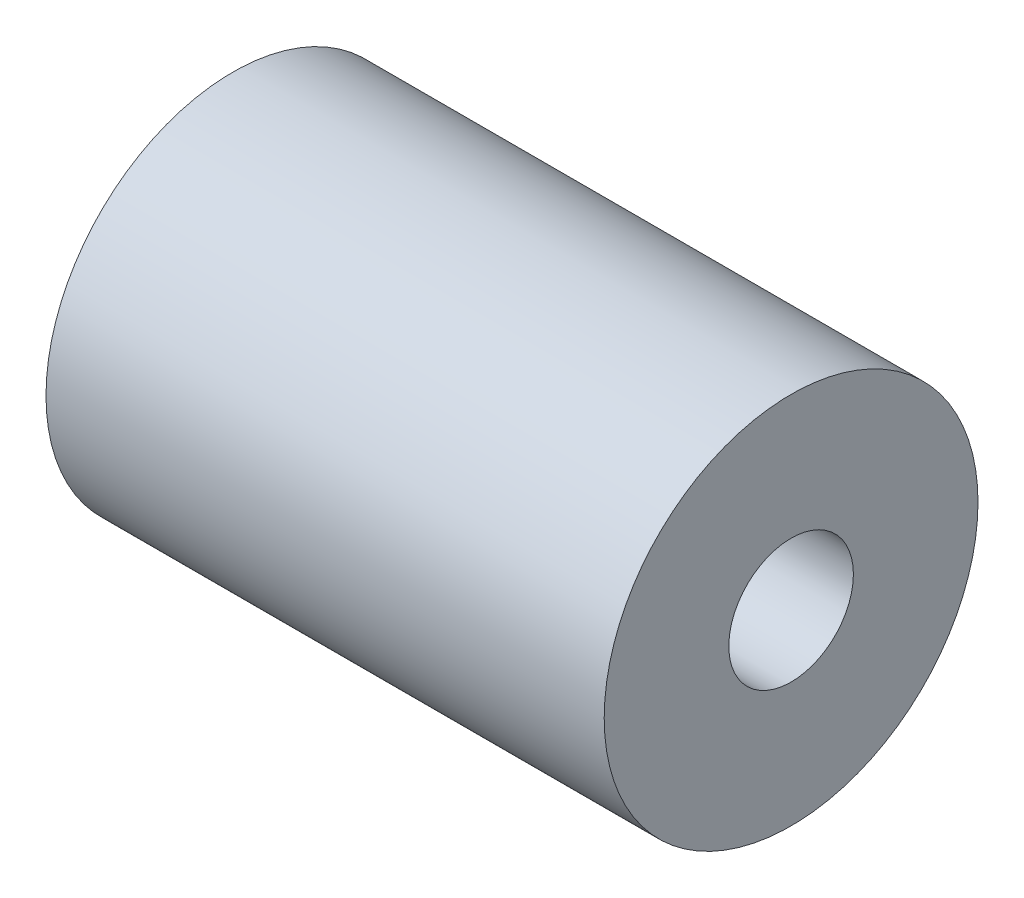
ISO-10303-21;
HEADER;
FILE_DESCRIPTION(('STEP AP214'),'2;1');
FILE_NAME('part.step','',(''),(''),'','','');
FILE_SCHEMA(('AUTOMOTIVE_DESIGN { 1 0 10303 214 1 1 1 1 }'));
ENDSEC;
DATA;
#1=APPLICATION_CONTEXT('core data for automotive mechanical design processes');
#2=APPLICATION_PROTOCOL_DEFINITION('international standard','automotive_design',2000,#1);
#3=PRODUCT_CONTEXT('',#1,'mechanical');
#4=PRODUCT('Part','Part','',(#3));
#5=PRODUCT_RELATED_PRODUCT_CATEGORY('part','',(#4));
#6=PRODUCT_DEFINITION_FORMATION('','',#4);
#7=PRODUCT_DEFINITION_CONTEXT('part definition',#1,'design');
#8=PRODUCT_DEFINITION('design','',#6,#7);
#9=PRODUCT_DEFINITION_SHAPE('','',#8);
#10=(LENGTH_UNIT() NAMED_UNIT(*) SI_UNIT(.MILLI.,.METRE.));
#11=(NAMED_UNIT(*) PLANE_ANGLE_UNIT() SI_UNIT($,.RADIAN.));
#12=(NAMED_UNIT(*) SI_UNIT($,.STERADIAN.) SOLID_ANGLE_UNIT());
#13=UNCERTAINTY_MEASURE_WITH_UNIT(LENGTH_MEASURE(1.E-05),#10,'distance_accuracy_value','');
#14=(GEOMETRIC_REPRESENTATION_CONTEXT(3) GLOBAL_UNCERTAINTY_ASSIGNED_CONTEXT((#13)) GLOBAL_UNIT_ASSIGNED_CONTEXT((#10,
#11,#12)) REPRESENTATION_CONTEXT('',''));
#15=CARTESIAN_POINT('',(0.,0.,0.));
#16=DIRECTION('',(0.,0.,1.));
#17=DIRECTION('',(1.,0.,0.));
#18=AXIS2_PLACEMENT_3D('',#15,#16,#17);
#19=CARTESIAN_POINT('',(28.448,0.,0.));
#20=DIRECTION('',(1.,0.,0.));
#21=DIRECTION('',(0.,0.,-1.));
#22=AXIS2_PLACEMENT_3D('',#19,#20,#21);
#23=PLANE('',#22);
#24=CARTESIAN_POINT('',(28.448,0.,0.));
#25=DIRECTION('',(1.,0.,0.));
#26=DIRECTION('',(0.,0.,-1.));
#27=AXIS2_PLACEMENT_3D('',#24,#25,#26);
#28=CIRCLE('',#27,9.525);
#29=CARTESIAN_POINT('',(28.448,0.,-9.525));
#30=VERTEX_POINT('',#29);
#31=EDGE_CURVE('E10',#30,#30,#28,.T.);
#32=ORIENTED_EDGE('',*,*,#31,.T.);
#33=EDGE_LOOP('',(#32));
#34=FACE_BOUND('',#33,.T.);
#35=CARTESIAN_POINT('',(28.448,0.,0.));
#36=DIRECTION('',(1.,0.,0.));
#37=DIRECTION('',(0.,0.,-1.));
#38=AXIS2_PLACEMENT_3D('',#35,#36,#37);
#39=CIRCLE('',#38,3.175);
#40=CARTESIAN_POINT('',(28.448,0.,-3.175));
#41=VERTEX_POINT('',#40);
#42=EDGE_CURVE('E46',#41,#41,#39,.T.);
#43=ORIENTED_EDGE('',*,*,#42,.F.);
#44=EDGE_LOOP('',(#43));
#45=FACE_BOUND('',#44,.T.);
#46=ADVANCED_FACE('F35',(#34,#45),#23,.T.);
#47=CARTESIAN_POINT('',(0.,0.,0.));
#48=DIRECTION('',(1.,0.,0.));
#49=DIRECTION('',(0.,0.,-1.));
#50=AXIS2_PLACEMENT_3D('',#47,#48,#49);
#51=PLANE('',#50);
#52=CARTESIAN_POINT('',(0.,0.,0.));
#53=DIRECTION('',(1.,0.,0.));
#54=DIRECTION('',(0.,0.,-1.));
#55=AXIS2_PLACEMENT_3D('',#52,#53,#54);
#56=CIRCLE('',#55,9.525);
#57=CARTESIAN_POINT('',(0.,0.,-9.525));
#58=VERTEX_POINT('',#57);
#59=EDGE_CURVE('E39',#58,#58,#56,.T.);
#60=ORIENTED_EDGE('',*,*,#59,.F.);
#61=EDGE_LOOP('',(#60));
#62=FACE_BOUND('',#61,.T.);
#63=CARTESIAN_POINT('',(0.,0.,0.));
#64=DIRECTION('',(1.,0.,0.));
#65=DIRECTION('',(0.,0.,-1.));
#66=AXIS2_PLACEMENT_3D('',#63,#64,#65);
#67=CIRCLE('',#66,3.175);
#68=CARTESIAN_POINT('',(0.,0.,-3.175));
#69=VERTEX_POINT('',#68);
#70=EDGE_CURVE('E48',#69,#69,#67,.T.);
#71=ORIENTED_EDGE('',*,*,#70,.T.);
#72=EDGE_LOOP('',(#71));
#73=FACE_BOUND('',#72,.T.);
#74=ADVANCED_FACE('F58',(#62,#73),#51,.F.);
#75=CARTESIAN_POINT('',(28.448,0.,0.));
#76=DIRECTION('',(-1.,0.,0.));
#77=DIRECTION('',(0.,0.,1.));
#78=AXIS2_PLACEMENT_3D('',#75,#76,#77);
#79=CYLINDRICAL_SURFACE('',#78,9.525);
#80=ORIENTED_EDGE('',*,*,#31,.F.);
#81=EDGE_LOOP('',(#80));
#82=FACE_BOUND('',#81,.T.);
#83=ORIENTED_EDGE('',*,*,#59,.T.);
#84=EDGE_LOOP('',(#83));
#85=FACE_BOUND('',#84,.T.);
#86=ADVANCED_FACE('F37',(#82,#85),#79,.T.);
#87=CARTESIAN_POINT('',(28.448,0.,0.));
#88=DIRECTION('',(-1.,0.,0.));
#89=DIRECTION('',(0.,0.,1.));
#90=AXIS2_PLACEMENT_3D('',#87,#88,#89);
#91=CYLINDRICAL_SURFACE('',#90,3.175);
#92=ORIENTED_EDGE('',*,*,#42,.T.);
#93=EDGE_LOOP('',(#92));
#94=FACE_BOUND('',#93,.T.);
#95=ORIENTED_EDGE('',*,*,#70,.F.);
#96=EDGE_LOOP('',(#95));
#97=FACE_BOUND('',#96,.T.);
#98=ADVANCED_FACE('F54',(#94,#97),#91,.F.);
#99=CLOSED_SHELL('',(#46,#74,#86,#98));
#100=MANIFOLD_SOLID_BREP('B2',#99);
#101=ADVANCED_BREP_SHAPE_REPRESENTATION('',(#18,#100),#14);
#102=SHAPE_DEFINITION_REPRESENTATION(#9,#101);
ENDSEC;
END-ISO-10303-21;
